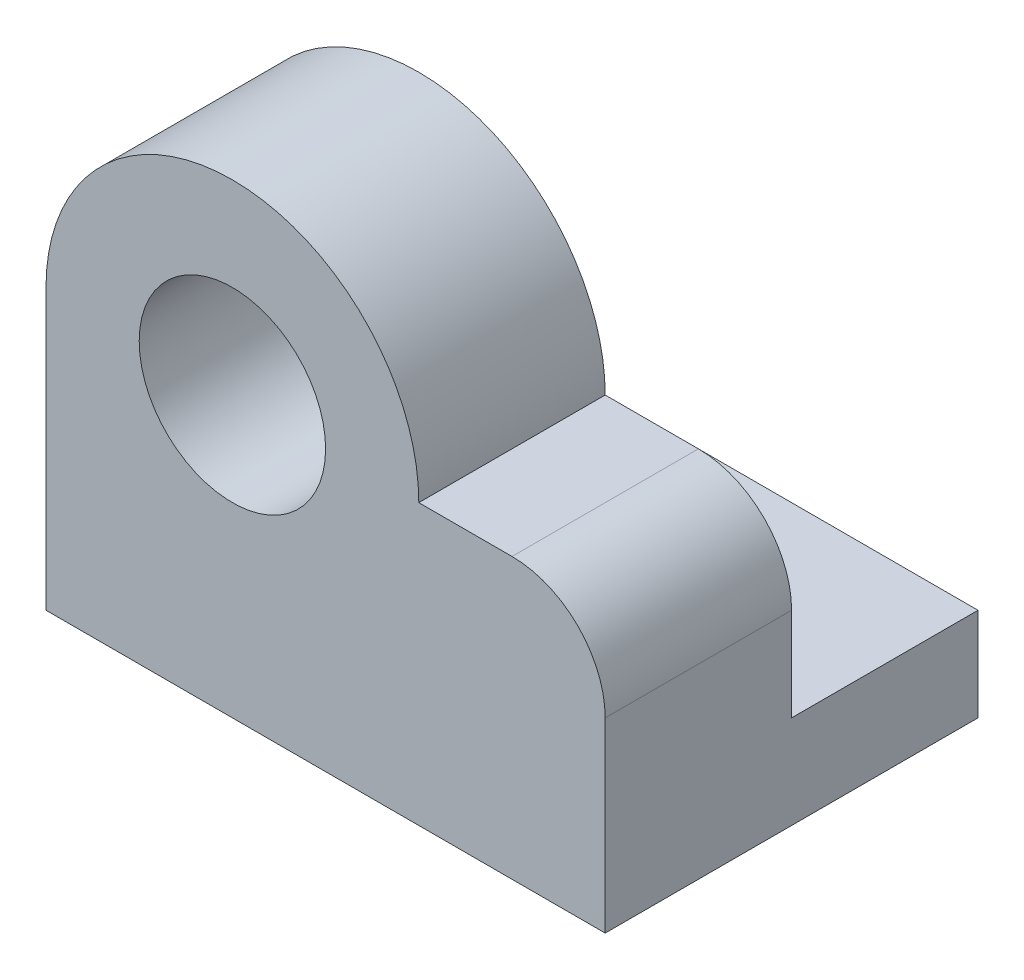
ISO-10303-21;
HEADER;
FILE_DESCRIPTION(('STEP AP214'),'2;1');
FILE_NAME('part.step','',(''),(''),'','','');
FILE_SCHEMA(('AUTOMOTIVE_DESIGN { 1 0 10303 214 1 1 1 1 }'));
ENDSEC;
DATA;
#1=APPLICATION_CONTEXT('core data for automotive mechanical design processes');
#2=APPLICATION_PROTOCOL_DEFINITION('international standard','automotive_design',2000,#1);
#3=PRODUCT_CONTEXT('',#1,'mechanical');
#4=PRODUCT('Part','Part','',(#3));
#5=PRODUCT_RELATED_PRODUCT_CATEGORY('part','',(#4));
#6=PRODUCT_DEFINITION_FORMATION('','',#4);
#7=PRODUCT_DEFINITION_CONTEXT('part definition',#1,'design');
#8=PRODUCT_DEFINITION('design','',#6,#7);
#9=PRODUCT_DEFINITION_SHAPE('','',#8);
#10=(LENGTH_UNIT() NAMED_UNIT(*) SI_UNIT(.MILLI.,.METRE.));
#11=(NAMED_UNIT(*) PLANE_ANGLE_UNIT() SI_UNIT($,.RADIAN.));
#12=(NAMED_UNIT(*) SI_UNIT($,.STERADIAN.) SOLID_ANGLE_UNIT());
#13=UNCERTAINTY_MEASURE_WITH_UNIT(LENGTH_MEASURE(1.E-05),#10,'distance_accuracy_value','');
#14=(GEOMETRIC_REPRESENTATION_CONTEXT(3) GLOBAL_UNCERTAINTY_ASSIGNED_CONTEXT((#13)) GLOBAL_UNIT_ASSIGNED_CONTEXT((#10,
#11,#12)) REPRESENTATION_CONTEXT('',''));
#15=CARTESIAN_POINT('',(0.,0.,0.));
#16=DIRECTION('',(0.,0.,1.));
#17=DIRECTION('',(1.,0.,0.));
#18=AXIS2_PLACEMENT_3D('',#15,#16,#17);
#19=CARTESIAN_POINT('',(20.,0.,20.));
#20=DIRECTION('',(0.,1.,0.));
#21=DIRECTION('',(0.,0.,1.));
#22=AXIS2_PLACEMENT_3D('',#19,#20,#21);
#23=PLANE('',#22);
#24=DIRECTION('',(1.,0.,0.));
#25=VECTOR('',#24,1.);
#26=CARTESIAN_POINT('',(20.,0.,0.));
#27=LINE('',#26,#25);
#28=CARTESIAN_POINT('',(20.,0.,0.));
#29=VERTEX_POINT('',#28);
#30=CARTESIAN_POINT('',(30.,0.,0.));
#31=VERTEX_POINT('',#30);
#32=EDGE_CURVE('E146',#29,#31,#27,.T.);
#33=ORIENTED_EDGE('',*,*,#32,.F.);
#34=DIRECTION('',(0.,0.,-1.));
#35=VECTOR('',#34,1.);
#36=CARTESIAN_POINT('',(20.,0.,20.));
#37=LINE('',#36,#35);
#38=CARTESIAN_POINT('',(20.,0.,20.));
#39=VERTEX_POINT('',#38);
#40=EDGE_CURVE('E11',#39,#29,#37,.T.);
#41=ORIENTED_EDGE('',*,*,#40,.F.);
#42=DIRECTION('',(1.,0.,0.));
#43=VECTOR('',#42,1.);
#44=CARTESIAN_POINT('',(20.,0.,20.));
#45=LINE('',#44,#43);
#46=CARTESIAN_POINT('',(30.,0.,20.));
#47=VERTEX_POINT('',#46);
#48=EDGE_CURVE('E153',#39,#47,#45,.T.);
#49=ORIENTED_EDGE('',*,*,#48,.T.);
#50=DIRECTION('',(0.,0.,-1.));
#51=VECTOR('',#50,1.);
#52=CARTESIAN_POINT('',(30.,0.,20.));
#53=LINE('',#52,#51);
#54=EDGE_CURVE('E45',#47,#31,#53,.T.);
#55=ORIENTED_EDGE('',*,*,#54,.T.);
#56=EDGE_LOOP('',(#33,#41,#49,#55));
#57=FACE_BOUND('',#56,.T.);
#58=ADVANCED_FACE('F39',(#57),#23,.T.);
#59=CARTESIAN_POINT('',(0.,0.,20.));
#60=DIRECTION('',(0.,0.,-1.));
#61=DIRECTION('',(-1.,0.,0.));
#62=AXIS2_PLACEMENT_3D('',#59,#60,#61);
#63=CYLINDRICAL_SURFACE('',#62,20.);
#64=CARTESIAN_POINT('',(0.,0.,0.));
#65=DIRECTION('',(0.,0.,1.));
#66=DIRECTION('',(1.,0.,0.));
#67=AXIS2_PLACEMENT_3D('',#64,#65,#66);
#68=CIRCLE('',#67,20.);
#69=CARTESIAN_POINT('',(-20.,0.,0.));
#70=VERTEX_POINT('',#69);
#71=EDGE_CURVE('E76',#29,#70,#68,.T.);
#72=ORIENTED_EDGE('',*,*,#71,.T.);
#73=DIRECTION('',(0.,0.,-1.));
#74=VECTOR('',#73,1.);
#75=CARTESIAN_POINT('',(-20.,0.,20.));
#76=LINE('',#75,#74);
#77=CARTESIAN_POINT('',(-20.,0.,20.));
#78=VERTEX_POINT('',#77);
#79=EDGE_CURVE('E48',#78,#70,#76,.T.);
#80=ORIENTED_EDGE('',*,*,#79,.F.);
#81=CARTESIAN_POINT('',(0.,0.,20.));
#82=DIRECTION('',(0.,0.,1.));
#83=DIRECTION('',(1.,0.,0.));
#84=AXIS2_PLACEMENT_3D('',#81,#82,#83);
#85=CIRCLE('',#84,20.);
#86=EDGE_CURVE('E159',#39,#78,#85,.T.);
#87=ORIENTED_EDGE('',*,*,#86,.F.);
#88=ORIENTED_EDGE('',*,*,#40,.T.);
#89=EDGE_LOOP('',(#72,#80,#87,#88));
#90=FACE_BOUND('',#89,.T.);
#91=ADVANCED_FACE('F187',(#90),#63,.T.);
#92=CARTESIAN_POINT('',(-20.,0.,20.));
#93=DIRECTION('',(1.,0.,0.));
#94=DIRECTION('',(0.,1.,0.));
#95=AXIS2_PLACEMENT_3D('',#92,#93,#94);
#96=PLANE('',#95);
#97=DIRECTION('',(0.,-1.,0.));
#98=VECTOR('',#97,1.);
#99=CARTESIAN_POINT('',(-20.,0.,0.));
#100=LINE('',#99,#98);
#101=CARTESIAN_POINT('',(-20.,-20.,0.));
#102=VERTEX_POINT('',#101);
#103=EDGE_CURVE('E120',#70,#102,#100,.T.);
#104=ORIENTED_EDGE('',*,*,#103,.T.);
#105=DIRECTION('',(0.,0.,1.));
#106=VECTOR('',#105,1.);
#107=CARTESIAN_POINT('',(-20.,-20.,-20.));
#108=LINE('',#107,#106);
#109=CARTESIAN_POINT('',(-20.,-20.,-20.));
#110=VERTEX_POINT('',#109);
#111=EDGE_CURVE('E112',#110,#102,#108,.T.);
#112=ORIENTED_EDGE('',*,*,#111,.F.);
#113=DIRECTION('',(0.,-1.,0.));
#114=VECTOR('',#113,1.);
#115=CARTESIAN_POINT('',(-20.,-30.,-20.));
#116=LINE('',#115,#114);
#117=CARTESIAN_POINT('',(-20.,-30.,-20.));
#118=VERTEX_POINT('',#117);
#119=EDGE_CURVE('E113',#110,#118,#116,.T.);
#120=ORIENTED_EDGE('',*,*,#119,.T.);
#121=DIRECTION('',(0.,0.,1.));
#122=VECTOR('',#121,1.);
#123=CARTESIAN_POINT('',(-20.,-30.,-20.));
#124=LINE('',#123,#122);
#125=CARTESIAN_POINT('',(-20.,-30.,20.));
#126=VERTEX_POINT('',#125);
#127=EDGE_CURVE('E123',#118,#126,#124,.T.);
#128=ORIENTED_EDGE('',*,*,#127,.T.);
#129=DIRECTION('',(0.,-1.,0.));
#130=VECTOR('',#129,1.);
#131=CARTESIAN_POINT('',(-20.,0.,20.));
#132=LINE('',#131,#130);
#133=EDGE_CURVE('E158',#78,#126,#132,.T.);
#134=ORIENTED_EDGE('',*,*,#133,.F.);
#135=ORIENTED_EDGE('',*,*,#79,.T.);
#136=EDGE_LOOP('',(#104,#112,#120,#128,#134,#135));
#137=FACE_BOUND('',#136,.T.);
#138=ADVANCED_FACE('F114',(#137),#96,.F.);
#139=CARTESIAN_POINT('',(40.,-10.,20.));
#140=DIRECTION('',(1.,0.,0.));
#141=DIRECTION('',(0.,0.,-1.));
#142=AXIS2_PLACEMENT_3D('',#139,#140,#141);
#143=PLANE('',#142);
#144=DIRECTION('',(0.,-1.,0.));
#145=VECTOR('',#144,1.);
#146=CARTESIAN_POINT('',(40.,-10.,0.));
#147=LINE('',#146,#145);
#148=CARTESIAN_POINT('',(40.,-10.,0.));
#149=VERTEX_POINT('',#148);
#150=CARTESIAN_POINT('',(40.,-20.,0.));
#151=VERTEX_POINT('',#150);
#152=EDGE_CURVE('E170',#149,#151,#147,.T.);
#153=ORIENTED_EDGE('',*,*,#152,.F.);
#154=DIRECTION('',(0.,0.,-1.));
#155=VECTOR('',#154,1.);
#156=CARTESIAN_POINT('',(40.,-10.,20.));
#157=LINE('',#156,#155);
#158=CARTESIAN_POINT('',(40.,-10.,20.));
#159=VERTEX_POINT('',#158);
#160=EDGE_CURVE('E173',#159,#149,#157,.T.);
#161=ORIENTED_EDGE('',*,*,#160,.F.);
#162=DIRECTION('',(0.,-1.,0.));
#163=VECTOR('',#162,1.);
#164=CARTESIAN_POINT('',(40.,-10.,20.));
#165=LINE('',#164,#163);
#166=CARTESIAN_POINT('',(40.,-30.,20.));
#167=VERTEX_POINT('',#166);
#168=EDGE_CURVE('E156',#159,#167,#165,.T.);
#169=ORIENTED_EDGE('',*,*,#168,.T.);
#170=DIRECTION('',(0.,0.,1.));
#171=VECTOR('',#170,1.);
#172=CARTESIAN_POINT('',(40.,-30.,-20.));
#173=LINE('',#172,#171);
#174=CARTESIAN_POINT('',(40.,-30.,-20.));
#175=VERTEX_POINT('',#174);
#176=EDGE_CURVE('E149',#175,#167,#173,.T.);
#177=ORIENTED_EDGE('',*,*,#176,.F.);
#178=DIRECTION('',(0.,1.,0.));
#179=VECTOR('',#178,1.);
#180=CARTESIAN_POINT('',(40.,-20.,-20.));
#181=LINE('',#180,#179);
#182=CARTESIAN_POINT('',(40.,-20.,-20.));
#183=VERTEX_POINT('',#182);
#184=EDGE_CURVE('E125',#175,#183,#181,.T.);
#185=ORIENTED_EDGE('',*,*,#184,.T.);
#186=DIRECTION('',(0.,0.,1.));
#187=VECTOR('',#186,1.);
#188=CARTESIAN_POINT('',(40.,-20.,-20.));
#189=LINE('',#188,#187);
#190=EDGE_CURVE('E138',#183,#151,#189,.T.);
#191=ORIENTED_EDGE('',*,*,#190,.T.);
#192=EDGE_LOOP('',(#153,#161,#169,#177,#185,#191));
#193=FACE_BOUND('',#192,.T.);
#194=ADVANCED_FACE('F185',(#193),#143,.T.);
#195=CARTESIAN_POINT('',(30.,-10.,20.));
#196=DIRECTION('',(0.,0.,-1.));
#197=DIRECTION('',(-1.,0.,0.));
#198=AXIS2_PLACEMENT_3D('',#195,#196,#197);
#199=CYLINDRICAL_SURFACE('',#198,10.);
#200=CARTESIAN_POINT('',(30.,-10.,0.));
#201=DIRECTION('',(0.,0.,1.));
#202=DIRECTION('',(1.,0.,0.));
#203=AXIS2_PLACEMENT_3D('',#200,#201,#202);
#204=CIRCLE('',#203,10.);
#205=EDGE_CURVE('E163',#149,#31,#204,.T.);
#206=ORIENTED_EDGE('',*,*,#205,.T.);
#207=ORIENTED_EDGE('',*,*,#54,.F.);
#208=CARTESIAN_POINT('',(30.,-10.,20.));
#209=DIRECTION('',(0.,0.,1.));
#210=DIRECTION('',(1.,0.,0.));
#211=AXIS2_PLACEMENT_3D('',#208,#209,#210);
#212=CIRCLE('',#211,10.);
#213=EDGE_CURVE('E82',#159,#47,#212,.T.);
#214=ORIENTED_EDGE('',*,*,#213,.F.);
#215=ORIENTED_EDGE('',*,*,#160,.T.);
#216=EDGE_LOOP('',(#206,#207,#214,#215));
#217=FACE_BOUND('',#216,.T.);
#218=ADVANCED_FACE('F180',(#217),#199,.T.);
#219=CARTESIAN_POINT('',(30.,-10.,20.));
#220=DIRECTION('',(0.,0.,1.));
#221=DIRECTION('',(1.,0.,0.));
#222=AXIS2_PLACEMENT_3D('',#219,#220,#221);
#223=PLANE('',#222);
#224=CARTESIAN_POINT('',(0.,0.,20.));
#225=DIRECTION('',(0.,0.,1.));
#226=DIRECTION('',(1.,0.,0.));
#227=AXIS2_PLACEMENT_3D('',#224,#225,#226);
#228=CIRCLE('',#227,10.);
#229=CARTESIAN_POINT('',(10.,0.,20.));
#230=VERTEX_POINT('',#229);
#231=EDGE_CURVE('E137',#230,#230,#228,.T.);
#232=ORIENTED_EDGE('',*,*,#231,.F.);
#233=EDGE_LOOP('',(#232));
#234=FACE_BOUND('',#233,.T.);
#235=ORIENTED_EDGE('',*,*,#48,.F.);
#236=ORIENTED_EDGE('',*,*,#86,.T.);
#237=ORIENTED_EDGE('',*,*,#133,.T.);
#238=DIRECTION('',(1.,0.,0.));
#239=VECTOR('',#238,1.);
#240=CARTESIAN_POINT('',(40.,-30.,20.));
#241=LINE('',#240,#239);
#242=EDGE_CURVE('E140',#126,#167,#241,.T.);
#243=ORIENTED_EDGE('',*,*,#242,.T.);
#244=ORIENTED_EDGE('',*,*,#168,.F.);
#245=ORIENTED_EDGE('',*,*,#213,.T.);
#246=EDGE_LOOP('',(#235,#236,#237,#243,#244,#245));
#247=FACE_BOUND('',#246,.T.);
#248=ADVANCED_FACE('F190',(#234,#247),#223,.T.);
#249=CARTESIAN_POINT('',(30.,-10.,0.));
#250=DIRECTION('',(0.,0.,1.));
#251=DIRECTION('',(1.,0.,0.));
#252=AXIS2_PLACEMENT_3D('',#249,#250,#251);
#253=PLANE('',#252);
#254=CARTESIAN_POINT('',(0.,0.,0.));
#255=DIRECTION('',(0.,0.,-1.));
#256=DIRECTION('',(-1.,0.,0.));
#257=AXIS2_PLACEMENT_3D('',#254,#255,#256);
#258=CIRCLE('',#257,10.);
#259=CARTESIAN_POINT('',(-10.,0.,0.));
#260=VERTEX_POINT('',#259);
#261=EDGE_CURVE('E226',#260,#260,#258,.T.);
#262=ORIENTED_EDGE('',*,*,#261,.F.);
#263=EDGE_LOOP('',(#262));
#264=FACE_BOUND('',#263,.T.);
#265=ORIENTED_EDGE('',*,*,#32,.T.);
#266=ORIENTED_EDGE('',*,*,#205,.F.);
#267=ORIENTED_EDGE('',*,*,#152,.T.);
#268=DIRECTION('',(-1.,0.,0.));
#269=VECTOR('',#268,1.);
#270=CARTESIAN_POINT('',(40.,-20.,0.));
#271=LINE('',#270,#269);
#272=EDGE_CURVE('E168',#151,#102,#271,.T.);
#273=ORIENTED_EDGE('',*,*,#272,.T.);
#274=ORIENTED_EDGE('',*,*,#103,.F.);
#275=ORIENTED_EDGE('',*,*,#71,.F.);
#276=EDGE_LOOP('',(#265,#266,#267,#273,#274,#275));
#277=FACE_BOUND('',#276,.T.);
#278=ADVANCED_FACE('F177',(#264,#277),#253,.F.);
#279=CARTESIAN_POINT('',(-20.,-20.,-20.));
#280=DIRECTION('',(0.,1.,0.));
#281=DIRECTION('',(-1.,0.,0.));
#282=AXIS2_PLACEMENT_3D('',#279,#280,#281);
#283=PLANE('',#282);
#284=ORIENTED_EDGE('',*,*,#272,.F.);
#285=ORIENTED_EDGE('',*,*,#190,.F.);
#286=DIRECTION('',(-1.,0.,0.));
#287=VECTOR('',#286,1.);
#288=CARTESIAN_POINT('',(-20.,-20.,-20.));
#289=LINE('',#288,#287);
#290=EDGE_CURVE('E129',#183,#110,#289,.T.);
#291=ORIENTED_EDGE('',*,*,#290,.T.);
#292=ORIENTED_EDGE('',*,*,#111,.T.);
#293=EDGE_LOOP('',(#284,#285,#291,#292));
#294=FACE_BOUND('',#293,.T.);
#295=ADVANCED_FACE('F133',(#294),#283,.T.);
#296=CARTESIAN_POINT('',(40.,-30.,-20.));
#297=DIRECTION('',(0.,-1.,0.));
#298=DIRECTION('',(1.,0.,0.));
#299=AXIS2_PLACEMENT_3D('',#296,#297,#298);
#300=PLANE('',#299);
#301=ORIENTED_EDGE('',*,*,#242,.F.);
#302=ORIENTED_EDGE('',*,*,#127,.F.);
#303=DIRECTION('',(1.,0.,0.));
#304=VECTOR('',#303,1.);
#305=CARTESIAN_POINT('',(40.,-30.,-20.));
#306=LINE('',#305,#304);
#307=EDGE_CURVE('E135',#118,#175,#306,.T.);
#308=ORIENTED_EDGE('',*,*,#307,.T.);
#309=ORIENTED_EDGE('',*,*,#176,.T.);
#310=EDGE_LOOP('',(#301,#302,#308,#309));
#311=FACE_BOUND('',#310,.T.);
#312=ADVANCED_FACE('F183',(#311),#300,.T.);
#313=CARTESIAN_POINT('',(0.,0.,-20.));
#314=DIRECTION('',(0.,0.,-1.));
#315=DIRECTION('',(-1.,0.,0.));
#316=AXIS2_PLACEMENT_3D('',#313,#314,#315);
#317=PLANE('',#316);
#318=ORIENTED_EDGE('',*,*,#290,.F.);
#319=ORIENTED_EDGE('',*,*,#184,.F.);
#320=ORIENTED_EDGE('',*,*,#307,.F.);
#321=ORIENTED_EDGE('',*,*,#119,.F.);
#322=EDGE_LOOP('',(#318,#319,#320,#321));
#323=FACE_BOUND('',#322,.T.);
#324=ADVANCED_FACE('F130',(#323),#317,.T.);
#325=CARTESIAN_POINT('',(0.,0.,40.));
#326=DIRECTION('',(0.,0.,-1.));
#327=DIRECTION('',(-1.,0.,0.));
#328=AXIS2_PLACEMENT_3D('',#325,#326,#327);
#329=CYLINDRICAL_SURFACE('',#328,10.);
#330=ORIENTED_EDGE('',*,*,#231,.T.);
#331=EDGE_LOOP('',(#330));
#332=FACE_BOUND('',#331,.T.);
#333=ORIENTED_EDGE('',*,*,#261,.T.);
#334=EDGE_LOOP('',(#333));
#335=FACE_BOUND('',#334,.T.);
#336=ADVANCED_FACE('F220',(#332,#335),#329,.F.);
#337=CLOSED_SHELL('',(#58,#91,#138,#194,#218,#248,#278,#295,#312,#324,#336));
#338=MANIFOLD_SOLID_BREP('B2',#337);
#339=ADVANCED_BREP_SHAPE_REPRESENTATION('',(#18,#338),#14);
#340=SHAPE_DEFINITION_REPRESENTATION(#9,#339);
ENDSEC;
END-ISO-10303-21;
